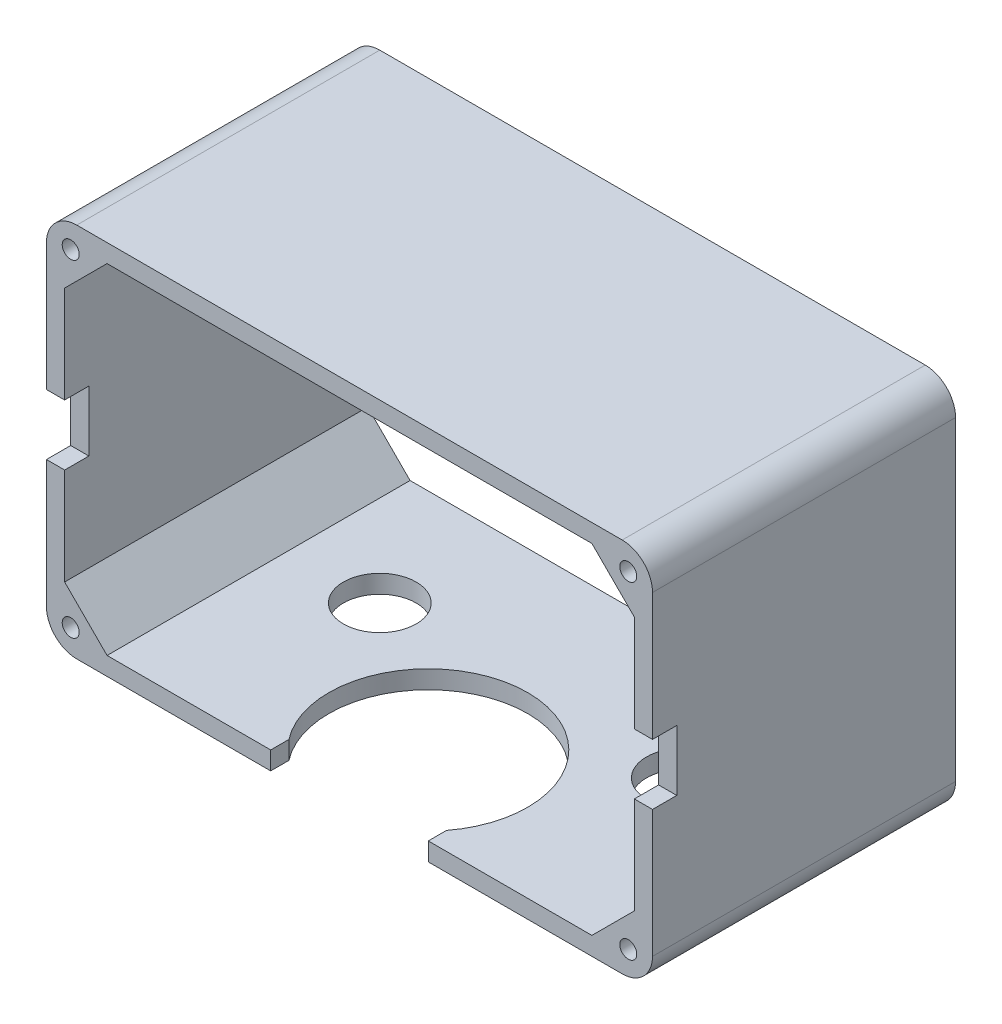
ISO-10303-21;
HEADER;
FILE_DESCRIPTION(('STEP AP214'),'2;1');
FILE_NAME('part.step','',(''),(''),'','','');
FILE_SCHEMA(('AUTOMOTIVE_DESIGN { 1 0 10303 214 1 1 1 1 }'));
ENDSEC;
DATA;
#1=APPLICATION_CONTEXT('core data for automotive mechanical design processes');
#2=APPLICATION_PROTOCOL_DEFINITION('international standard','automotive_design',2000,#1);
#3=PRODUCT_CONTEXT('',#1,'mechanical');
#4=PRODUCT('Part','Part','',(#3));
#5=PRODUCT_RELATED_PRODUCT_CATEGORY('part','',(#4));
#6=PRODUCT_DEFINITION_FORMATION('','',#4);
#7=PRODUCT_DEFINITION_CONTEXT('part definition',#1,'design');
#8=PRODUCT_DEFINITION('design','',#6,#7);
#9=PRODUCT_DEFINITION_SHAPE('','',#8);
#10=(LENGTH_UNIT() NAMED_UNIT(*) SI_UNIT(.MILLI.,.METRE.));
#11=(NAMED_UNIT(*) PLANE_ANGLE_UNIT() SI_UNIT($,.RADIAN.));
#12=(NAMED_UNIT(*) SI_UNIT($,.STERADIAN.) SOLID_ANGLE_UNIT());
#13=UNCERTAINTY_MEASURE_WITH_UNIT(LENGTH_MEASURE(1.E-05),#10,'distance_accuracy_value','');
#14=(GEOMETRIC_REPRESENTATION_CONTEXT(3) GLOBAL_UNCERTAINTY_ASSIGNED_CONTEXT((#13)) GLOBAL_UNIT_ASSIGNED_CONTEXT((#10,
#11,#12)) REPRESENTATION_CONTEXT('',''));
#15=CARTESIAN_POINT('',(0.,0.,0.));
#16=DIRECTION('',(0.,0.,1.));
#17=DIRECTION('',(1.,0.,0.));
#18=AXIS2_PLACEMENT_3D('',#15,#16,#17);
#19=CARTESIAN_POINT('',(-45.,26.,50.));
#20=DIRECTION('',(0.,0.,-1.));
#21=DIRECTION('',(-1.,0.,0.));
#22=AXIS2_PLACEMENT_3D('',#19,#20,#21);
#23=PLANE('',#22);
#24=CARTESIAN_POINT('',(-46.,27.,50.));
#25=DIRECTION('',(0.,0.,1.));
#26=DIRECTION('',(1.,0.,0.));
#27=AXIS2_PLACEMENT_3D('',#24,#25,#26);
#28=CIRCLE('',#27,1.4);
#29=CARTESIAN_POINT('',(-44.6,27.,50.));
#30=VERTEX_POINT('',#29);
#31=EDGE_CURVE('E313',#30,#30,#28,.T.);
#32=ORIENTED_EDGE('',*,*,#31,.F.);
#33=EDGE_LOOP('',(#32));
#34=FACE_BOUND('',#33,.T.);
#35=CARTESIAN_POINT('',(46.,27.,50.));
#36=DIRECTION('',(0.,0.,-1.));
#37=DIRECTION('',(-1.,0.,0.));
#38=AXIS2_PLACEMENT_3D('',#35,#36,#37);
#39=CIRCLE('',#38,1.4);
#40=CARTESIAN_POINT('',(44.6,27.,50.));
#41=VERTEX_POINT('',#40);
#42=EDGE_CURVE('E317',#41,#41,#39,.T.);
#43=ORIENTED_EDGE('',*,*,#42,.T.);
#44=EDGE_LOOP('',(#43));
#45=FACE_BOUND('',#44,.T.);
#46=DIRECTION('',(0.,-1.,0.));
#47=VECTOR('',#46,1.);
#48=CARTESIAN_POINT('',(-50.,26.,50.));
#49=LINE('',#48,#47);
#50=CARTESIAN_POINT('',(-50.,26.,50.));
#51=VERTEX_POINT('',#50);
#52=CARTESIAN_POINT('',(-50.,4.99999999999998,50.));
#53=VERTEX_POINT('',#52);
#54=EDGE_CURVE('E248',#51,#53,#49,.T.);
#55=ORIENTED_EDGE('',*,*,#54,.T.);
#56=DIRECTION('',(1.,0.,0.));
#57=VECTOR('',#56,1.);
#58=CARTESIAN_POINT('',(-50.,4.99999999999998,50.));
#59=LINE('',#58,#57);
#60=CARTESIAN_POINT('',(-47.,4.99999999999998,50.));
#61=VERTEX_POINT('',#60);
#62=EDGE_CURVE('E458',#53,#61,#59,.T.);
#63=ORIENTED_EDGE('',*,*,#62,.T.);
#64=DIRECTION('',(0.,-1.,0.));
#65=VECTOR('',#64,1.);
#66=CARTESIAN_POINT('',(-47.,23.,50.));
#67=LINE('',#66,#65);
#68=CARTESIAN_POINT('',(-47.,21.,50.));
#69=VERTEX_POINT('',#68);
#70=EDGE_CURVE('E370',#69,#61,#67,.T.);
#71=ORIENTED_EDGE('',*,*,#70,.F.);
#72=DIRECTION('',(0.707106781186547,0.707106781186548,0.));
#73=VECTOR('',#72,1.);
#74=CARTESIAN_POINT('',(-47.,21.,50.));
#75=LINE('',#74,#73);
#76=CARTESIAN_POINT('',(-40.,28.,50.));
#77=VERTEX_POINT('',#76);
#78=EDGE_CURVE('E312',#69,#77,#75,.T.);
#79=ORIENTED_EDGE('',*,*,#78,.T.);
#80=DIRECTION('',(-1.,0.,0.));
#81=VECTOR('',#80,1.);
#82=CARTESIAN_POINT('',(-42.,28.,50.));
#83=LINE('',#82,#81);
#84=CARTESIAN_POINT('',(40.,28.,50.));
#85=VERTEX_POINT('',#84);
#86=EDGE_CURVE('E278',#85,#77,#83,.T.);
#87=ORIENTED_EDGE('',*,*,#86,.F.);
#88=DIRECTION('',(-0.707106781186547,0.707106781186548,0.));
#89=VECTOR('',#88,1.);
#90=CARTESIAN_POINT('',(47.,21.,50.));
#91=LINE('',#90,#89);
#92=CARTESIAN_POINT('',(47.,21.,50.));
#93=VERTEX_POINT('',#92);
#94=EDGE_CURVE('E316',#93,#85,#91,.T.);
#95=ORIENTED_EDGE('',*,*,#94,.F.);
#96=DIRECTION('',(0.,1.,0.));
#97=VECTOR('',#96,1.);
#98=CARTESIAN_POINT('',(47.,23.,50.));
#99=LINE('',#98,#97);
#100=CARTESIAN_POINT('',(47.,4.99999999999999,50.));
#101=VERTEX_POINT('',#100);
#102=EDGE_CURVE('E377',#101,#93,#99,.T.);
#103=ORIENTED_EDGE('',*,*,#102,.F.);
#104=CARTESIAN_POINT('',(50.,4.99999999999999,50.));
#105=VERTEX_POINT('',#104);
#106=EDGE_CURVE('E465',#101,#105,#59,.T.);
#107=ORIENTED_EDGE('',*,*,#106,.T.);
#108=DIRECTION('',(0.,1.,0.));
#109=VECTOR('',#108,1.);
#110=CARTESIAN_POINT('',(50.,26.,50.));
#111=LINE('',#110,#109);
#112=CARTESIAN_POINT('',(50.,26.,50.));
#113=VERTEX_POINT('',#112);
#114=EDGE_CURVE('E265',#105,#113,#111,.T.);
#115=ORIENTED_EDGE('',*,*,#114,.T.);
#116=CARTESIAN_POINT('',(45.,26.,50.));
#117=DIRECTION('',(0.,0.,1.));
#118=DIRECTION('',(1.,0.,0.));
#119=AXIS2_PLACEMENT_3D('',#116,#117,#118);
#120=CIRCLE('',#119,5.);
#121=CARTESIAN_POINT('',(45.,31.,50.));
#122=VERTEX_POINT('',#121);
#123=EDGE_CURVE('E269',#113,#122,#120,.T.);
#124=ORIENTED_EDGE('',*,*,#123,.T.);
#125=DIRECTION('',(-1.,0.,0.));
#126=VECTOR('',#125,1.);
#127=CARTESIAN_POINT('',(-45.,31.,50.));
#128=LINE('',#127,#126);
#129=CARTESIAN_POINT('',(-45.,31.,50.));
#130=VERTEX_POINT('',#129);
#131=EDGE_CURVE('E271',#122,#130,#128,.T.);
#132=ORIENTED_EDGE('',*,*,#131,.T.);
#133=CARTESIAN_POINT('',(-45.,26.,50.));
#134=DIRECTION('',(0.,0.,1.));
#135=DIRECTION('',(-1.,0.,0.));
#136=AXIS2_PLACEMENT_3D('',#133,#134,#135);
#137=CIRCLE('',#136,5.);
#138=EDGE_CURVE('E249',#130,#51,#137,.T.);
#139=ORIENTED_EDGE('',*,*,#138,.T.);
#140=EDGE_LOOP('',(#55,#63,#71,#79,#87,#95,#103,#107,#115,#124,#132,#139));
#141=FACE_BOUND('',#140,.T.);
#142=ADVANCED_FACE('F38',(#34,#45,#141),#23,.F.);
#143=CARTESIAN_POINT('',(46.,-27.,50.));
#144=DIRECTION('',(0.,0.,1.));
#145=DIRECTION('',(-1.,0.,0.));
#146=AXIS2_PLACEMENT_3D('',#143,#144,#145);
#147=CIRCLE('',#146,1.4);
#148=CARTESIAN_POINT('',(44.6,-27.,50.));
#149=VERTEX_POINT('',#148);
#150=EDGE_CURVE('E321',#149,#149,#147,.T.);
#151=ORIENTED_EDGE('',*,*,#150,.F.);
#152=EDGE_LOOP('',(#151));
#153=FACE_BOUND('',#152,.T.);
#154=CARTESIAN_POINT('',(50.,-26.,50.));
#155=VERTEX_POINT('',#154);
#156=CARTESIAN_POINT('',(50.,-5.00000000000001,50.));
#157=VERTEX_POINT('',#156);
#158=EDGE_CURVE('E266',#155,#157,#111,.T.);
#159=ORIENTED_EDGE('',*,*,#158,.T.);
#160=DIRECTION('',(1.,0.,0.));
#161=VECTOR('',#160,1.);
#162=CARTESIAN_POINT('',(-50.,-5.00000000000002,50.));
#163=LINE('',#162,#161);
#164=CARTESIAN_POINT('',(47.,-5.00000000000001,50.));
#165=VERTEX_POINT('',#164);
#166=EDGE_CURVE('E63',#165,#157,#163,.T.);
#167=ORIENTED_EDGE('',*,*,#166,.F.);
#168=CARTESIAN_POINT('',(47.,-21.,50.));
#169=VERTEX_POINT('',#168);
#170=EDGE_CURVE('E378',#169,#165,#99,.T.);
#171=ORIENTED_EDGE('',*,*,#170,.F.);
#172=DIRECTION('',(-0.707106781186547,-0.707106781186548,0.));
#173=VECTOR('',#172,1.);
#174=CARTESIAN_POINT('',(47.,-21.,50.));
#175=LINE('',#174,#173);
#176=CARTESIAN_POINT('',(40.,-28.,50.));
#177=VERTEX_POINT('',#176);
#178=EDGE_CURVE('E320',#169,#177,#175,.T.);
#179=ORIENTED_EDGE('',*,*,#178,.T.);
#180=DIRECTION('',(1.,0.,0.));
#181=VECTOR('',#180,1.);
#182=CARTESIAN_POINT('',(-42.,-28.,50.));
#183=LINE('',#182,#181);
#184=CARTESIAN_POINT('',(13.,-28.,50.));
#185=VERTEX_POINT('',#184);
#186=EDGE_CURVE('E373',#185,#177,#183,.T.);
#187=ORIENTED_EDGE('',*,*,#186,.F.);
#188=DIRECTION('',(0.,-1.,0.));
#189=VECTOR('',#188,1.);
#190=CARTESIAN_POINT('',(13.,-21.,50.));
#191=LINE('',#190,#189);
#192=CARTESIAN_POINT('',(13.,-31.,50.));
#193=VERTEX_POINT('',#192);
#194=EDGE_CURVE('E426',#185,#193,#191,.T.);
#195=ORIENTED_EDGE('',*,*,#194,.T.);
#196=DIRECTION('',(1.,0.,0.));
#197=VECTOR('',#196,1.);
#198=CARTESIAN_POINT('',(-45.,-31.,50.));
#199=LINE('',#198,#197);
#200=CARTESIAN_POINT('',(45.,-31.,50.));
#201=VERTEX_POINT('',#200);
#202=EDGE_CURVE('E259',#193,#201,#199,.T.);
#203=ORIENTED_EDGE('',*,*,#202,.T.);
#204=CARTESIAN_POINT('',(45.,-26.,50.));
#205=DIRECTION('',(0.,0.,1.));
#206=DIRECTION('',(1.,0.,0.));
#207=AXIS2_PLACEMENT_3D('',#204,#205,#206);
#208=CIRCLE('',#207,5.);
#209=EDGE_CURVE('E263',#201,#155,#208,.T.);
#210=ORIENTED_EDGE('',*,*,#209,.T.);
#211=EDGE_LOOP('',(#159,#167,#171,#179,#187,#195,#203,#210));
#212=FACE_BOUND('',#211,.T.);
#213=ADVANCED_FACE('F508',(#153,#212),#23,.F.);
#214=CARTESIAN_POINT('',(-47.,23.,50.));
#215=DIRECTION('',(1.,0.,0.));
#216=DIRECTION('',(0.,1.,0.));
#217=AXIS2_PLACEMENT_3D('',#214,#215,#216);
#218=PLANE('',#217);
#219=DIRECTION('',(0.,0.,1.));
#220=VECTOR('',#219,1.);
#221=CARTESIAN_POINT('',(-47.,4.99999999999998,50.));
#222=LINE('',#221,#220);
#223=CARTESIAN_POINT('',(-47.,4.99999999999998,46.));
#224=VERTEX_POINT('',#223);
#225=EDGE_CURVE('E446',#224,#61,#222,.T.);
#226=ORIENTED_EDGE('',*,*,#225,.F.);
#227=DIRECTION('',(0.,1.,0.));
#228=VECTOR('',#227,1.);
#229=CARTESIAN_POINT('',(-47.,23.,46.));
#230=LINE('',#229,#228);
#231=CARTESIAN_POINT('',(-47.,-5.00000000000002,46.));
#232=VERTEX_POINT('',#231);
#233=EDGE_CURVE('E452',#232,#224,#230,.T.);
#234=ORIENTED_EDGE('',*,*,#233,.F.);
#235=DIRECTION('',(0.,0.,-1.));
#236=VECTOR('',#235,1.);
#237=CARTESIAN_POINT('',(-47.,-5.00000000000002,50.));
#238=LINE('',#237,#236);
#239=CARTESIAN_POINT('',(-47.,-5.00000000000002,50.));
#240=VERTEX_POINT('',#239);
#241=EDGE_CURVE('E395',#240,#232,#238,.T.);
#242=ORIENTED_EDGE('',*,*,#241,.F.);
#243=CARTESIAN_POINT('',(-47.,-21.,50.));
#244=VERTEX_POINT('',#243);
#245=EDGE_CURVE('E242',#240,#244,#67,.T.);
#246=ORIENTED_EDGE('',*,*,#245,.T.);
#247=DIRECTION('',(0.,0.,1.));
#248=VECTOR('',#247,1.);
#249=CARTESIAN_POINT('',(-47.,-21.,0.));
#250=LINE('',#249,#248);
#251=CARTESIAN_POINT('',(-47.,-21.,0.));
#252=VERTEX_POINT('',#251);
#253=EDGE_CURVE('E328',#252,#244,#250,.T.);
#254=ORIENTED_EDGE('',*,*,#253,.F.);
#255=DIRECTION('',(0.,-1.,0.));
#256=VECTOR('',#255,1.);
#257=CARTESIAN_POINT('',(-47.,23.,0.));
#258=LINE('',#257,#256);
#259=CARTESIAN_POINT('',(-47.,21.,0.));
#260=VERTEX_POINT('',#259);
#261=EDGE_CURVE('E368',#260,#252,#258,.T.);
#262=ORIENTED_EDGE('',*,*,#261,.F.);
#263=DIRECTION('',(0.,0.,1.));
#264=VECTOR('',#263,1.);
#265=CARTESIAN_POINT('',(-47.,21.,0.));
#266=LINE('',#265,#264);
#267=EDGE_CURVE('E362',#260,#69,#266,.T.);
#268=ORIENTED_EDGE('',*,*,#267,.T.);
#269=ORIENTED_EDGE('',*,*,#70,.T.);
#270=EDGE_LOOP('',(#226,#234,#242,#246,#254,#262,#268,#269));
#271=FACE_BOUND('',#270,.T.);
#272=ADVANCED_FACE('F393',(#271),#218,.T.);
#273=CARTESIAN_POINT('',(-42.,-28.,50.));
#274=DIRECTION('',(0.,1.,0.));
#275=DIRECTION('',(0.,0.,1.));
#276=AXIS2_PLACEMENT_3D('',#273,#274,#275);
#277=PLANE('',#276);
#278=CARTESIAN_POINT('',(-25.,-28.,20.));
#279=DIRECTION('',(0.,1.,0.));
#280=DIRECTION('',(0.,0.,1.));
#281=AXIS2_PLACEMENT_3D('',#278,#279,#280);
#282=CIRCLE('',#281,6.);
#283=CARTESIAN_POINT('',(-25.,-28.,26.));
#284=VERTEX_POINT('',#283);
#285=EDGE_CURVE('E436',#284,#284,#282,.T.);
#286=ORIENTED_EDGE('',*,*,#285,.F.);
#287=EDGE_LOOP('',(#286));
#288=FACE_BOUND('',#287,.T.);
#289=CARTESIAN_POINT('',(25.,-28.,20.));
#290=DIRECTION('',(0.,1.,0.));
#291=DIRECTION('',(0.,0.,1.));
#292=AXIS2_PLACEMENT_3D('',#289,#290,#291);
#293=CIRCLE('',#292,6.);
#294=CARTESIAN_POINT('',(25.,-28.,26.));
#295=VERTEX_POINT('',#294);
#296=EDGE_CURVE('E439',#295,#295,#293,.T.);
#297=ORIENTED_EDGE('',*,*,#296,.F.);
#298=EDGE_LOOP('',(#297));
#299=FACE_BOUND('',#298,.T.);
#300=DIRECTION('',(0.,0.,1.));
#301=VECTOR('',#300,1.);
#302=CARTESIAN_POINT('',(-13.,-28.,50.));
#303=LINE('',#302,#301);
#304=CARTESIAN_POINT('',(-13.,-28.,47.));
#305=VERTEX_POINT('',#304);
#306=CARTESIAN_POINT('',(-13.,-28.,50.));
#307=VERTEX_POINT('',#306);
#308=EDGE_CURVE('E413',#305,#307,#303,.T.);
#309=ORIENTED_EDGE('',*,*,#308,.F.);
#310=CARTESIAN_POINT('',(0.,-28.,37.));
#311=DIRECTION('',(0.,1.,0.));
#312=DIRECTION('',(0.,0.,1.));
#313=AXIS2_PLACEMENT_3D('',#310,#311,#312);
#314=CIRCLE('',#313,16.4012194668567);
#315=CARTESIAN_POINT('',(13.,-28.,47.));
#316=VERTEX_POINT('',#315);
#317=EDGE_CURVE('E417',#316,#305,#314,.T.);
#318=ORIENTED_EDGE('',*,*,#317,.F.);
#319=DIRECTION('',(0.,0.,-1.));
#320=VECTOR('',#319,1.);
#321=CARTESIAN_POINT('',(13.,-28.,50.0000000000001));
#322=LINE('',#321,#320);
#323=EDGE_CURVE('E415',#185,#316,#322,.T.);
#324=ORIENTED_EDGE('',*,*,#323,.F.);
#325=ORIENTED_EDGE('',*,*,#186,.T.);
#326=DIRECTION('',(0.,0.,1.));
#327=VECTOR('',#326,1.);
#328=CARTESIAN_POINT('',(40.,-28.,0.));
#329=LINE('',#328,#327);
#330=CARTESIAN_POINT('',(40.,-28.,0.));
#331=VERTEX_POINT('',#330);
#332=EDGE_CURVE('E340',#331,#177,#329,.T.);
#333=ORIENTED_EDGE('',*,*,#332,.F.);
#334=DIRECTION('',(1.,0.,0.));
#335=VECTOR('',#334,1.);
#336=CARTESIAN_POINT('',(-42.,-28.,0.));
#337=LINE('',#336,#335);
#338=CARTESIAN_POINT('',(-40.,-28.,0.));
#339=VERTEX_POINT('',#338);
#340=EDGE_CURVE('E384',#339,#331,#337,.T.);
#341=ORIENTED_EDGE('',*,*,#340,.F.);
#342=DIRECTION('',(0.,0.,1.));
#343=VECTOR('',#342,1.);
#344=CARTESIAN_POINT('',(-40.,-28.,0.));
#345=LINE('',#344,#343);
#346=CARTESIAN_POINT('',(-40.,-28.,50.));
#347=VERTEX_POINT('',#346);
#348=EDGE_CURVE('E333',#339,#347,#345,.T.);
#349=ORIENTED_EDGE('',*,*,#348,.T.);
#350=EDGE_CURVE('E374',#347,#307,#183,.T.);
#351=ORIENTED_EDGE('',*,*,#350,.T.);
#352=EDGE_LOOP('',(#309,#318,#324,#325,#333,#341,#349,#351));
#353=FACE_BOUND('',#352,.T.);
#354=ADVANCED_FACE('F524',(#288,#299,#353),#277,.T.);
#355=CARTESIAN_POINT('',(47.,23.,50.));
#356=DIRECTION('',(-1.,0.,0.));
#357=DIRECTION('',(0.,-1.,0.));
#358=AXIS2_PLACEMENT_3D('',#355,#356,#357);
#359=PLANE('',#358);
#360=DIRECTION('',(0.,0.,-1.));
#361=VECTOR('',#360,1.);
#362=CARTESIAN_POINT('',(47.,4.99999999999999,50.));
#363=LINE('',#362,#361);
#364=CARTESIAN_POINT('',(47.,4.99999999999999,46.));
#365=VERTEX_POINT('',#364);
#366=EDGE_CURVE('E450',#101,#365,#363,.T.);
#367=ORIENTED_EDGE('',*,*,#366,.F.);
#368=ORIENTED_EDGE('',*,*,#102,.T.);
#369=DIRECTION('',(0.,0.,1.));
#370=VECTOR('',#369,1.);
#371=CARTESIAN_POINT('',(47.,21.,0.));
#372=LINE('',#371,#370);
#373=CARTESIAN_POINT('',(47.,21.,0.));
#374=VERTEX_POINT('',#373);
#375=EDGE_CURVE('E352',#374,#93,#372,.T.);
#376=ORIENTED_EDGE('',*,*,#375,.F.);
#377=DIRECTION('',(0.,1.,0.));
#378=VECTOR('',#377,1.);
#379=CARTESIAN_POINT('',(47.,23.,0.));
#380=LINE('',#379,#378);
#381=CARTESIAN_POINT('',(47.,-21.,0.));
#382=VERTEX_POINT('',#381);
#383=EDGE_CURVE('E386',#382,#374,#380,.T.);
#384=ORIENTED_EDGE('',*,*,#383,.F.);
#385=DIRECTION('',(0.,0.,1.));
#386=VECTOR('',#385,1.);
#387=CARTESIAN_POINT('',(47.,-21.,0.));
#388=LINE('',#387,#386);
#389=EDGE_CURVE('E338',#382,#169,#388,.T.);
#390=ORIENTED_EDGE('',*,*,#389,.T.);
#391=ORIENTED_EDGE('',*,*,#170,.T.);
#392=DIRECTION('',(0.,0.,1.));
#393=VECTOR('',#392,1.);
#394=CARTESIAN_POINT('',(47.,-5.00000000000001,50.));
#395=LINE('',#394,#393);
#396=CARTESIAN_POINT('',(47.,-5.00000000000001,46.));
#397=VERTEX_POINT('',#396);
#398=EDGE_CURVE('E457',#397,#165,#395,.T.);
#399=ORIENTED_EDGE('',*,*,#398,.F.);
#400=DIRECTION('',(0.,-1.,0.));
#401=VECTOR('',#400,1.);
#402=CARTESIAN_POINT('',(47.,23.,46.));
#403=LINE('',#402,#401);
#404=EDGE_CURVE('E454',#365,#397,#403,.T.);
#405=ORIENTED_EDGE('',*,*,#404,.F.);
#406=EDGE_LOOP('',(#367,#368,#376,#384,#390,#391,#399,#405));
#407=FACE_BOUND('',#406,.T.);
#408=ADVANCED_FACE('F567',(#407),#359,.T.);
#409=CARTESIAN_POINT('',(-42.,28.,50.));
#410=DIRECTION('',(0.,-1.,0.));
#411=DIRECTION('',(0.,0.,-1.));
#412=AXIS2_PLACEMENT_3D('',#409,#410,#411);
#413=PLANE('',#412);
#414=DIRECTION('',(-1.,0.,0.));
#415=VECTOR('',#414,1.);
#416=CARTESIAN_POINT('',(-42.,28.,0.));
#417=LINE('',#416,#415);
#418=CARTESIAN_POINT('',(40.,28.,0.));
#419=VERTEX_POINT('',#418);
#420=CARTESIAN_POINT('',(-40.,28.,0.));
#421=VERTEX_POINT('',#420);
#422=EDGE_CURVE('E387',#419,#421,#417,.T.);
#423=ORIENTED_EDGE('',*,*,#422,.F.);
#424=DIRECTION('',(0.,0.,1.));
#425=VECTOR('',#424,1.);
#426=CARTESIAN_POINT('',(40.,28.,0.));
#427=LINE('',#426,#425);
#428=EDGE_CURVE('E349',#419,#85,#427,.T.);
#429=ORIENTED_EDGE('',*,*,#428,.T.);
#430=ORIENTED_EDGE('',*,*,#86,.T.);
#431=DIRECTION('',(0.,0.,1.));
#432=VECTOR('',#431,1.);
#433=CARTESIAN_POINT('',(-40.,28.,0.));
#434=LINE('',#433,#432);
#435=EDGE_CURVE('E365',#421,#77,#434,.T.);
#436=ORIENTED_EDGE('',*,*,#435,.F.);
#437=EDGE_LOOP('',(#423,#429,#430,#436));
#438=FACE_BOUND('',#437,.T.);
#439=ADVANCED_FACE('F560',(#438),#413,.T.);
#440=CARTESIAN_POINT('',(-46.,-27.,50.));
#441=DIRECTION('',(0.,0.,-1.));
#442=DIRECTION('',(1.,0.,0.));
#443=AXIS2_PLACEMENT_3D('',#440,#441,#442);
#444=CIRCLE('',#443,1.4);
#445=CARTESIAN_POINT('',(-44.6,-27.,50.));
#446=VERTEX_POINT('',#445);
#447=EDGE_CURVE('E409',#446,#446,#444,.T.);
#448=ORIENTED_EDGE('',*,*,#447,.T.);
#449=EDGE_LOOP('',(#448));
#450=FACE_BOUND('',#449,.T.);
#451=ORIENTED_EDGE('',*,*,#245,.F.);
#452=CARTESIAN_POINT('',(-50.,-5.00000000000002,50.));
#453=VERTEX_POINT('',#452);
#454=EDGE_CURVE('E229',#453,#240,#163,.T.);
#455=ORIENTED_EDGE('',*,*,#454,.F.);
#456=CARTESIAN_POINT('',(-50.,-26.,50.));
#457=VERTEX_POINT('',#456);
#458=EDGE_CURVE('E239',#453,#457,#49,.T.);
#459=ORIENTED_EDGE('',*,*,#458,.T.);
#460=CARTESIAN_POINT('',(-45.,-26.,50.));
#461=DIRECTION('',(0.,0.,1.));
#462=DIRECTION('',(-1.,0.,0.));
#463=AXIS2_PLACEMENT_3D('',#460,#461,#462);
#464=CIRCLE('',#463,5.);
#465=CARTESIAN_POINT('',(-45.,-31.,50.));
#466=VERTEX_POINT('',#465);
#467=EDGE_CURVE('E252',#457,#466,#464,.T.);
#468=ORIENTED_EDGE('',*,*,#467,.T.);
#469=CARTESIAN_POINT('',(-13.,-31.,50.));
#470=VERTEX_POINT('',#469);
#471=EDGE_CURVE('E260',#466,#470,#199,.T.);
#472=ORIENTED_EDGE('',*,*,#471,.T.);
#473=DIRECTION('',(0.,-1.,0.));
#474=VECTOR('',#473,1.);
#475=CARTESIAN_POINT('',(-13.,-21.,50.));
#476=LINE('',#475,#474);
#477=EDGE_CURVE('E419',#307,#470,#476,.T.);
#478=ORIENTED_EDGE('',*,*,#477,.F.);
#479=ORIENTED_EDGE('',*,*,#350,.F.);
#480=DIRECTION('',(0.707106781186547,-0.707106781186548,0.));
#481=VECTOR('',#480,1.);
#482=CARTESIAN_POINT('',(-47.,-21.,50.));
#483=LINE('',#482,#481);
#484=EDGE_CURVE('E401',#244,#347,#483,.T.);
#485=ORIENTED_EDGE('',*,*,#484,.F.);
#486=EDGE_LOOP('',(#451,#455,#459,#468,#472,#478,#479,#485));
#487=FACE_BOUND('',#486,.T.);
#488=ADVANCED_FACE('F238',(#450,#487),#23,.F.);
#489=CARTESIAN_POINT('',(-45.,26.,0.));
#490=DIRECTION('',(0.,0.,-1.));
#491=DIRECTION('',(-1.,0.,0.));
#492=AXIS2_PLACEMENT_3D('',#489,#490,#491);
#493=PLANE('',#492);
#494=CARTESIAN_POINT('',(-46.,-27.,0.));
#495=DIRECTION('',(0.,0.,-1.));
#496=DIRECTION('',(-1.,0.,0.));
#497=AXIS2_PLACEMENT_3D('',#494,#495,#496);
#498=CIRCLE('',#497,1.4);
#499=CARTESIAN_POINT('',(-47.4,-27.,0.));
#500=VERTEX_POINT('',#499);
#501=EDGE_CURVE('E42',#500,#500,#498,.F.);
#502=ORIENTED_EDGE('',*,*,#501,.T.);
#503=EDGE_LOOP('',(#502));
#504=FACE_BOUND('',#503,.T.);
#505=ORIENTED_EDGE('',*,*,#261,.T.);
#506=DIRECTION('',(0.707106781186547,-0.707106781186548,0.));
#507=VECTOR('',#506,1.);
#508=CARTESIAN_POINT('',(-47.,-21.,0.));
#509=LINE('',#508,#507);
#510=EDGE_CURVE('E403',#252,#339,#509,.T.);
#511=ORIENTED_EDGE('',*,*,#510,.T.);
#512=ORIENTED_EDGE('',*,*,#340,.T.);
#513=DIRECTION('',(-0.707106781186547,-0.707106781186548,0.));
#514=VECTOR('',#513,1.);
#515=CARTESIAN_POINT('',(47.,-21.,0.));
#516=LINE('',#515,#514);
#517=EDGE_CURVE('E325',#382,#331,#516,.T.);
#518=ORIENTED_EDGE('',*,*,#517,.F.);
#519=ORIENTED_EDGE('',*,*,#383,.T.);
#520=DIRECTION('',(-0.707106781186547,0.707106781186548,0.));
#521=VECTOR('',#520,1.);
#522=CARTESIAN_POINT('',(47.,21.,0.));
#523=LINE('',#522,#521);
#524=EDGE_CURVE('E346',#374,#419,#523,.T.);
#525=ORIENTED_EDGE('',*,*,#524,.T.);
#526=ORIENTED_EDGE('',*,*,#422,.T.);
#527=DIRECTION('',(0.707106781186547,0.707106781186548,0.));
#528=VECTOR('',#527,1.);
#529=CARTESIAN_POINT('',(-47.,21.,0.));
#530=LINE('',#529,#528);
#531=EDGE_CURVE('E359',#260,#421,#530,.T.);
#532=ORIENTED_EDGE('',*,*,#531,.F.);
#533=EDGE_LOOP('',(#505,#511,#512,#518,#519,#525,#526,#532));
#534=FACE_BOUND('',#533,.T.);
#535=CARTESIAN_POINT('',(46.,-27.,0.));
#536=DIRECTION('',(0.,0.,-1.));
#537=DIRECTION('',(-1.,0.,0.));
#538=AXIS2_PLACEMENT_3D('',#535,#536,#537);
#539=CIRCLE('',#538,1.4);
#540=CARTESIAN_POINT('',(44.6,-27.,0.));
#541=VERTEX_POINT('',#540);
#542=EDGE_CURVE('E318',#541,#541,#539,.T.);
#543=ORIENTED_EDGE('',*,*,#542,.F.);
#544=EDGE_LOOP('',(#543));
#545=FACE_BOUND('',#544,.T.);
#546=CARTESIAN_POINT('',(46.,27.,0.));
#547=DIRECTION('',(0.,0.,-1.));
#548=DIRECTION('',(-1.,0.,0.));
#549=AXIS2_PLACEMENT_3D('',#546,#547,#548);
#550=CIRCLE('',#549,1.4);
#551=CARTESIAN_POINT('',(44.6,27.,0.));
#552=VERTEX_POINT('',#551);
#553=EDGE_CURVE('E314',#552,#552,#550,.F.);
#554=ORIENTED_EDGE('',*,*,#553,.T.);
#555=EDGE_LOOP('',(#554));
#556=FACE_BOUND('',#555,.T.);
#557=CARTESIAN_POINT('',(-46.,27.,0.));
#558=DIRECTION('',(0.,0.,-1.));
#559=DIRECTION('',(-1.,0.,0.));
#560=AXIS2_PLACEMENT_3D('',#557,#558,#559);
#561=CIRCLE('',#560,1.4);
#562=CARTESIAN_POINT('',(-47.4,27.,0.));
#563=VERTEX_POINT('',#562);
#564=EDGE_CURVE('E309',#563,#563,#561,.T.);
#565=ORIENTED_EDGE('',*,*,#564,.F.);
#566=EDGE_LOOP('',(#565));
#567=FACE_BOUND('',#566,.T.);
#568=CARTESIAN_POINT('',(-45.,26.,0.));
#569=DIRECTION('',(0.,0.,1.));
#570=DIRECTION('',(-1.,0.,0.));
#571=AXIS2_PLACEMENT_3D('',#568,#569,#570);
#572=CIRCLE('',#571,5.);
#573=CARTESIAN_POINT('',(-45.,31.,0.));
#574=VERTEX_POINT('',#573);
#575=CARTESIAN_POINT('',(-50.,26.,0.));
#576=VERTEX_POINT('',#575);
#577=EDGE_CURVE('E274',#574,#576,#572,.T.);
#578=ORIENTED_EDGE('',*,*,#577,.F.);
#579=DIRECTION('',(-1.,0.,0.));
#580=VECTOR('',#579,1.);
#581=CARTESIAN_POINT('',(-45.,31.,0.));
#582=LINE('',#581,#580);
#583=CARTESIAN_POINT('',(45.,31.,0.));
#584=VERTEX_POINT('',#583);
#585=EDGE_CURVE('E254',#584,#574,#582,.T.);
#586=ORIENTED_EDGE('',*,*,#585,.F.);
#587=CARTESIAN_POINT('',(45.,26.,0.));
#588=DIRECTION('',(0.,0.,1.));
#589=DIRECTION('',(1.,0.,0.));
#590=AXIS2_PLACEMENT_3D('',#587,#588,#589);
#591=CIRCLE('',#590,5.);
#592=CARTESIAN_POINT('',(50.,26.,0.));
#593=VERTEX_POINT('',#592);
#594=EDGE_CURVE('E288',#593,#584,#591,.T.);
#595=ORIENTED_EDGE('',*,*,#594,.F.);
#596=DIRECTION('',(0.,1.,0.));
#597=VECTOR('',#596,1.);
#598=CARTESIAN_POINT('',(50.,26.,0.));
#599=LINE('',#598,#597);
#600=CARTESIAN_POINT('',(50.,-26.,0.));
#601=VERTEX_POINT('',#600);
#602=EDGE_CURVE('E286',#601,#593,#599,.T.);
#603=ORIENTED_EDGE('',*,*,#602,.F.);
#604=CARTESIAN_POINT('',(45.,-26.,0.));
#605=DIRECTION('',(0.,0.,1.));
#606=DIRECTION('',(1.,0.,0.));
#607=AXIS2_PLACEMENT_3D('',#604,#605,#606);
#608=CIRCLE('',#607,5.);
#609=CARTESIAN_POINT('',(45.,-31.,0.));
#610=VERTEX_POINT('',#609);
#611=EDGE_CURVE('E284',#610,#601,#608,.T.);
#612=ORIENTED_EDGE('',*,*,#611,.F.);
#613=DIRECTION('',(1.,0.,0.));
#614=VECTOR('',#613,1.);
#615=CARTESIAN_POINT('',(-45.,-31.,0.));
#616=LINE('',#615,#614);
#617=CARTESIAN_POINT('',(-45.,-31.,0.));
#618=VERTEX_POINT('',#617);
#619=EDGE_CURVE('E282',#618,#610,#616,.T.);
#620=ORIENTED_EDGE('',*,*,#619,.F.);
#621=CARTESIAN_POINT('',(-45.,-26.,0.));
#622=DIRECTION('',(0.,0.,1.));
#623=DIRECTION('',(-1.,0.,0.));
#624=AXIS2_PLACEMENT_3D('',#621,#622,#623);
#625=CIRCLE('',#624,5.);
#626=CARTESIAN_POINT('',(-50.,-26.,0.));
#627=VERTEX_POINT('',#626);
#628=EDGE_CURVE('E280',#627,#618,#625,.T.);
#629=ORIENTED_EDGE('',*,*,#628,.F.);
#630=DIRECTION('',(0.,-1.,0.));
#631=VECTOR('',#630,1.);
#632=CARTESIAN_POINT('',(-50.,26.,0.));
#633=LINE('',#632,#631);
#634=EDGE_CURVE('E277',#576,#627,#633,.T.);
#635=ORIENTED_EDGE('',*,*,#634,.F.);
#636=EDGE_LOOP('',(#578,#586,#595,#603,#612,#620,#629,#635));
#637=FACE_BOUND('',#636,.T.);
#638=ADVANCED_FACE('F493',(#504,#534,#545,#556,#567,#637),#493,.T.);
#639=CARTESIAN_POINT('',(-45.,26.,50.));
#640=DIRECTION('',(0.,0.,-1.));
#641=DIRECTION('',(-1.,0.,0.));
#642=AXIS2_PLACEMENT_3D('',#639,#640,#641);
#643=CYLINDRICAL_SURFACE('',#642,5.);
#644=ORIENTED_EDGE('',*,*,#577,.T.);
#645=DIRECTION('',(0.,0.,-1.));
#646=VECTOR('',#645,1.);
#647=CARTESIAN_POINT('',(-50.,26.,50.));
#648=LINE('',#647,#646);
#649=EDGE_CURVE('E11',#51,#576,#648,.T.);
#650=ORIENTED_EDGE('',*,*,#649,.F.);
#651=ORIENTED_EDGE('',*,*,#138,.F.);
#652=DIRECTION('',(0.,0.,-1.));
#653=VECTOR('',#652,1.);
#654=CARTESIAN_POINT('',(-45.,31.,50.));
#655=LINE('',#654,#653);
#656=EDGE_CURVE('E273',#130,#574,#655,.T.);
#657=ORIENTED_EDGE('',*,*,#656,.T.);
#658=EDGE_LOOP('',(#644,#650,#651,#657));
#659=FACE_BOUND('',#658,.T.);
#660=ADVANCED_FACE('F40',(#659),#643,.T.);
#661=CARTESIAN_POINT('',(-50.,26.,50.));
#662=DIRECTION('',(1.,0.,0.));
#663=DIRECTION('',(0.,1.,0.));
#664=AXIS2_PLACEMENT_3D('',#661,#662,#663);
#665=PLANE('',#664);
#666=DIRECTION('',(0.,1.,0.));
#667=VECTOR('',#666,1.);
#668=CARTESIAN_POINT('',(-50.,4.99999999999998,46.));
#669=LINE('',#668,#667);
#670=CARTESIAN_POINT('',(-50.,-5.00000000000002,46.));
#671=VERTEX_POINT('',#670);
#672=CARTESIAN_POINT('',(-50.,4.99999999999998,46.));
#673=VERTEX_POINT('',#672);
#674=EDGE_CURVE('E55',#671,#673,#669,.T.);
#675=ORIENTED_EDGE('',*,*,#674,.T.);
#676=DIRECTION('',(0.,0.,1.));
#677=VECTOR('',#676,1.);
#678=CARTESIAN_POINT('',(-50.,4.99999999999998,50.));
#679=LINE('',#678,#677);
#680=EDGE_CURVE('E474',#673,#53,#679,.T.);
#681=ORIENTED_EDGE('',*,*,#680,.T.);
#682=ORIENTED_EDGE('',*,*,#54,.F.);
#683=ORIENTED_EDGE('',*,*,#649,.T.);
#684=ORIENTED_EDGE('',*,*,#634,.T.);
#685=DIRECTION('',(0.,0.,-1.));
#686=VECTOR('',#685,1.);
#687=CARTESIAN_POINT('',(-50.,-26.,50.));
#688=LINE('',#687,#686);
#689=EDGE_CURVE('E47',#457,#627,#688,.T.);
#690=ORIENTED_EDGE('',*,*,#689,.F.);
#691=ORIENTED_EDGE('',*,*,#458,.F.);
#692=DIRECTION('',(0.,0.,-1.));
#693=VECTOR('',#692,1.);
#694=CARTESIAN_POINT('',(-50.,-5.00000000000002,50.));
#695=LINE('',#694,#693);
#696=EDGE_CURVE('E226',#453,#671,#695,.T.);
#697=ORIENTED_EDGE('',*,*,#696,.T.);
#698=EDGE_LOOP('',(#675,#681,#682,#683,#684,#690,#691,#697));
#699=FACE_BOUND('',#698,.T.);
#700=ADVANCED_FACE('F245',(#699),#665,.F.);
#701=CARTESIAN_POINT('',(-45.,-26.,50.));
#702=DIRECTION('',(0.,0.,-1.));
#703=DIRECTION('',(-1.,0.,0.));
#704=AXIS2_PLACEMENT_3D('',#701,#702,#703);
#705=CYLINDRICAL_SURFACE('',#704,5.);
#706=ORIENTED_EDGE('',*,*,#628,.T.);
#707=DIRECTION('',(0.,0.,-1.));
#708=VECTOR('',#707,1.);
#709=CARTESIAN_POINT('',(-45.,-31.,50.));
#710=LINE('',#709,#708);
#711=EDGE_CURVE('E305',#466,#618,#710,.T.);
#712=ORIENTED_EDGE('',*,*,#711,.F.);
#713=ORIENTED_EDGE('',*,*,#467,.F.);
#714=ORIENTED_EDGE('',*,*,#689,.T.);
#715=EDGE_LOOP('',(#706,#712,#713,#714));
#716=FACE_BOUND('',#715,.T.);
#717=ADVANCED_FACE('F490',(#716),#705,.T.);
#718=CARTESIAN_POINT('',(-45.,-31.,50.));
#719=DIRECTION('',(0.,1.,0.));
#720=DIRECTION('',(-1.,0.,0.));
#721=AXIS2_PLACEMENT_3D('',#718,#719,#720);
#722=PLANE('',#721);
#723=CARTESIAN_POINT('',(-25.,-31.,20.));
#724=DIRECTION('',(0.,-1.,0.));
#725=DIRECTION('',(0.,0.,-1.));
#726=AXIS2_PLACEMENT_3D('',#723,#724,#725);
#727=CIRCLE('',#726,6.);
#728=CARTESIAN_POINT('',(-25.,-31.,14.));
#729=VERTEX_POINT('',#728);
#730=EDGE_CURVE('E442',#729,#729,#727,.T.);
#731=ORIENTED_EDGE('',*,*,#730,.F.);
#732=EDGE_LOOP('',(#731));
#733=FACE_BOUND('',#732,.T.);
#734=CARTESIAN_POINT('',(25.,-31.,20.));
#735=DIRECTION('',(0.,-1.,0.));
#736=DIRECTION('',(0.,0.,-1.));
#737=AXIS2_PLACEMENT_3D('',#734,#735,#736);
#738=CIRCLE('',#737,6.);
#739=CARTESIAN_POINT('',(25.,-31.,14.));
#740=VERTEX_POINT('',#739);
#741=EDGE_CURVE('E443',#740,#740,#738,.T.);
#742=ORIENTED_EDGE('',*,*,#741,.F.);
#743=EDGE_LOOP('',(#742));
#744=FACE_BOUND('',#743,.T.);
#745=CARTESIAN_POINT('',(0.,-31.,37.));
#746=DIRECTION('',(0.,-1.,0.));
#747=DIRECTION('',(0.,0.,-1.));
#748=AXIS2_PLACEMENT_3D('',#745,#746,#747);
#749=CIRCLE('',#748,16.4012194668567);
#750=CARTESIAN_POINT('',(-13.,-31.,47.));
#751=VERTEX_POINT('',#750);
#752=CARTESIAN_POINT('',(13.,-31.,47.));
#753=VERTEX_POINT('',#752);
#754=EDGE_CURVE('E431',#751,#753,#749,.T.);
#755=ORIENTED_EDGE('',*,*,#754,.F.);
#756=DIRECTION('',(0.,0.,-1.));
#757=VECTOR('',#756,1.);
#758=CARTESIAN_POINT('',(-13.,-31.,50.));
#759=LINE('',#758,#757);
#760=EDGE_CURVE('E434',#470,#751,#759,.T.);
#761=ORIENTED_EDGE('',*,*,#760,.F.);
#762=ORIENTED_EDGE('',*,*,#471,.F.);
#763=ORIENTED_EDGE('',*,*,#711,.T.);
#764=ORIENTED_EDGE('',*,*,#619,.T.);
#765=DIRECTION('',(0.,0.,-1.));
#766=VECTOR('',#765,1.);
#767=CARTESIAN_POINT('',(45.,-31.,50.));
#768=LINE('',#767,#766);
#769=EDGE_CURVE('E302',#201,#610,#768,.T.);
#770=ORIENTED_EDGE('',*,*,#769,.F.);
#771=ORIENTED_EDGE('',*,*,#202,.F.);
#772=DIRECTION('',(0.,0.,1.));
#773=VECTOR('',#772,1.);
#774=CARTESIAN_POINT('',(13.,-31.,50.));
#775=LINE('',#774,#773);
#776=EDGE_CURVE('E424',#753,#193,#775,.T.);
#777=ORIENTED_EDGE('',*,*,#776,.F.);
#778=EDGE_LOOP('',(#755,#761,#762,#763,#764,#770,#771,#777));
#779=FACE_BOUND('',#778,.T.);
#780=ADVANCED_FACE('F499',(#733,#744,#779),#722,.F.);
#781=CARTESIAN_POINT('',(45.,-26.,50.));
#782=DIRECTION('',(0.,0.,-1.));
#783=DIRECTION('',(-1.,0.,0.));
#784=AXIS2_PLACEMENT_3D('',#781,#782,#783);
#785=CYLINDRICAL_SURFACE('',#784,5.);
#786=ORIENTED_EDGE('',*,*,#611,.T.);
#787=DIRECTION('',(0.,0.,-1.));
#788=VECTOR('',#787,1.);
#789=CARTESIAN_POINT('',(50.,-26.,50.));
#790=LINE('',#789,#788);
#791=EDGE_CURVE('E299',#155,#601,#790,.T.);
#792=ORIENTED_EDGE('',*,*,#791,.F.);
#793=ORIENTED_EDGE('',*,*,#209,.F.);
#794=ORIENTED_EDGE('',*,*,#769,.T.);
#795=EDGE_LOOP('',(#786,#792,#793,#794));
#796=FACE_BOUND('',#795,.T.);
#797=ADVANCED_FACE('F504',(#796),#785,.T.);
#798=CARTESIAN_POINT('',(50.,26.,50.));
#799=DIRECTION('',(-1.,0.,0.));
#800=DIRECTION('',(0.,0.,1.));
#801=AXIS2_PLACEMENT_3D('',#798,#799,#800);
#802=PLANE('',#801);
#803=ORIENTED_EDGE('',*,*,#114,.F.);
#804=DIRECTION('',(0.,0.,1.));
#805=VECTOR('',#804,1.);
#806=CARTESIAN_POINT('',(50.,4.99999999999999,50.));
#807=LINE('',#806,#805);
#808=CARTESIAN_POINT('',(50.,4.99999999999999,46.));
#809=VERTEX_POINT('',#808);
#810=EDGE_CURVE('E234',#809,#105,#807,.T.);
#811=ORIENTED_EDGE('',*,*,#810,.F.);
#812=DIRECTION('',(0.,1.,0.));
#813=VECTOR('',#812,1.);
#814=CARTESIAN_POINT('',(50.,4.99999999999999,46.));
#815=LINE('',#814,#813);
#816=CARTESIAN_POINT('',(50.,-5.00000000000001,46.));
#817=VERTEX_POINT('',#816);
#818=EDGE_CURVE('E469',#817,#809,#815,.T.);
#819=ORIENTED_EDGE('',*,*,#818,.F.);
#820=DIRECTION('',(0.,0.,-1.));
#821=VECTOR('',#820,1.);
#822=CARTESIAN_POINT('',(50.,-5.00000000000001,50.));
#823=LINE('',#822,#821);
#824=EDGE_CURVE('E472',#157,#817,#823,.T.);
#825=ORIENTED_EDGE('',*,*,#824,.F.);
#826=ORIENTED_EDGE('',*,*,#158,.F.);
#827=ORIENTED_EDGE('',*,*,#791,.T.);
#828=ORIENTED_EDGE('',*,*,#602,.T.);
#829=DIRECTION('',(0.,0.,-1.));
#830=VECTOR('',#829,1.);
#831=CARTESIAN_POINT('',(50.,26.,50.));
#832=LINE('',#831,#830);
#833=EDGE_CURVE('E296',#113,#593,#832,.T.);
#834=ORIENTED_EDGE('',*,*,#833,.F.);
#835=EDGE_LOOP('',(#803,#811,#819,#825,#826,#827,#828,#834));
#836=FACE_BOUND('',#835,.T.);
#837=ADVANCED_FACE('F873',(#836),#802,.F.);
#838=CARTESIAN_POINT('',(45.,26.,50.));
#839=DIRECTION('',(0.,0.,-1.));
#840=DIRECTION('',(-1.,0.,0.));
#841=AXIS2_PLACEMENT_3D('',#838,#839,#840);
#842=CYLINDRICAL_SURFACE('',#841,5.);
#843=ORIENTED_EDGE('',*,*,#594,.T.);
#844=DIRECTION('',(0.,0.,-1.));
#845=VECTOR('',#844,1.);
#846=CARTESIAN_POINT('',(45.,31.,50.));
#847=LINE('',#846,#845);
#848=EDGE_CURVE('E293',#122,#584,#847,.T.);
#849=ORIENTED_EDGE('',*,*,#848,.F.);
#850=ORIENTED_EDGE('',*,*,#123,.F.);
#851=ORIENTED_EDGE('',*,*,#833,.T.);
#852=EDGE_LOOP('',(#843,#849,#850,#851));
#853=FACE_BOUND('',#852,.T.);
#854=ADVANCED_FACE('F863',(#853),#842,.T.);
#855=CARTESIAN_POINT('',(-45.,31.,50.));
#856=DIRECTION('',(0.,-1.,0.));
#857=DIRECTION('',(0.,0.,-1.));
#858=AXIS2_PLACEMENT_3D('',#855,#856,#857);
#859=PLANE('',#858);
#860=ORIENTED_EDGE('',*,*,#585,.T.);
#861=ORIENTED_EDGE('',*,*,#656,.F.);
#862=ORIENTED_EDGE('',*,*,#131,.F.);
#863=ORIENTED_EDGE('',*,*,#848,.T.);
#864=EDGE_LOOP('',(#860,#861,#862,#863));
#865=FACE_BOUND('',#864,.T.);
#866=ADVANCED_FACE('F605',(#865),#859,.F.);
#867=CARTESIAN_POINT('',(-47.,21.,0.));
#868=DIRECTION('',(0.707106781186548,-0.707106781186547,0.));
#869=DIRECTION('',(0.707106781186547,0.707106781186548,0.));
#870=AXIS2_PLACEMENT_3D('',#867,#868,#869);
#871=PLANE('',#870);
#872=ORIENTED_EDGE('',*,*,#78,.F.);
#873=ORIENTED_EDGE('',*,*,#267,.F.);
#874=ORIENTED_EDGE('',*,*,#531,.T.);
#875=ORIENTED_EDGE('',*,*,#435,.T.);
#876=EDGE_LOOP('',(#872,#873,#874,#875));
#877=FACE_BOUND('',#876,.T.);
#878=ADVANCED_FACE('F531',(#877),#871,.T.);
#879=CARTESIAN_POINT('',(-46.,27.,-9.99999999999999));
#880=DIRECTION('',(0.,0.,1.));
#881=DIRECTION('',(1.,0.,0.));
#882=AXIS2_PLACEMENT_3D('',#879,#880,#881);
#883=CYLINDRICAL_SURFACE('',#882,1.4);
#884=ORIENTED_EDGE('',*,*,#564,.T.);
#885=EDGE_LOOP('',(#884));
#886=FACE_BOUND('',#885,.T.);
#887=ORIENTED_EDGE('',*,*,#31,.T.);
#888=EDGE_LOOP('',(#887));
#889=FACE_BOUND('',#888,.T.);
#890=ADVANCED_FACE('F599',(#886,#889),#883,.F.);
#891=CARTESIAN_POINT('',(47.,21.,0.));
#892=DIRECTION('',(0.707106781186548,0.707106781186547,0.));
#893=DIRECTION('',(-0.707106781186547,0.707106781186548,0.));
#894=AXIS2_PLACEMENT_3D('',#891,#892,#893);
#895=PLANE('',#894);
#896=ORIENTED_EDGE('',*,*,#94,.T.);
#897=ORIENTED_EDGE('',*,*,#428,.F.);
#898=ORIENTED_EDGE('',*,*,#524,.F.);
#899=ORIENTED_EDGE('',*,*,#375,.T.);
#900=EDGE_LOOP('',(#896,#897,#898,#899));
#901=FACE_BOUND('',#900,.T.);
#902=ADVANCED_FACE('F595',(#901),#895,.F.);
#903=CARTESIAN_POINT('',(46.,27.,-9.99999999999999));
#904=DIRECTION('',(0.,0.,1.));
#905=DIRECTION('',(1.,0.,0.));
#906=AXIS2_PLACEMENT_3D('',#903,#904,#905);
#907=CYLINDRICAL_SURFACE('',#906,1.4);
#908=ORIENTED_EDGE('',*,*,#553,.F.);
#909=EDGE_LOOP('',(#908));
#910=FACE_BOUND('',#909,.T.);
#911=ORIENTED_EDGE('',*,*,#42,.F.);
#912=EDGE_LOOP('',(#911));
#913=FACE_BOUND('',#912,.T.);
#914=ADVANCED_FACE('F591',(#910,#913),#907,.F.);
#915=CARTESIAN_POINT('',(47.,-21.,0.));
#916=DIRECTION('',(-0.707106781186548,0.707106781186547,0.));
#917=DIRECTION('',(-0.707106781186547,-0.707106781186548,0.));
#918=AXIS2_PLACEMENT_3D('',#915,#916,#917);
#919=PLANE('',#918);
#920=ORIENTED_EDGE('',*,*,#178,.F.);
#921=ORIENTED_EDGE('',*,*,#389,.F.);
#922=ORIENTED_EDGE('',*,*,#517,.T.);
#923=ORIENTED_EDGE('',*,*,#332,.T.);
#924=EDGE_LOOP('',(#920,#921,#922,#923));
#925=FACE_BOUND('',#924,.T.);
#926=ADVANCED_FACE('F588',(#925),#919,.T.);
#927=CARTESIAN_POINT('',(46.,-27.,-9.99999999999999));
#928=DIRECTION('',(0.,0.,1.));
#929=DIRECTION('',(1.,0.,0.));
#930=AXIS2_PLACEMENT_3D('',#927,#928,#929);
#931=CYLINDRICAL_SURFACE('',#930,1.4);
#932=ORIENTED_EDGE('',*,*,#542,.T.);
#933=EDGE_LOOP('',(#932));
#934=FACE_BOUND('',#933,.T.);
#935=ORIENTED_EDGE('',*,*,#150,.T.);
#936=EDGE_LOOP('',(#935));
#937=FACE_BOUND('',#936,.T.);
#938=ADVANCED_FACE('F581',(#934,#937),#931,.F.);
#939=CARTESIAN_POINT('',(-47.,-21.,0.));
#940=DIRECTION('',(-0.707106781186548,-0.707106781186547,0.));
#941=DIRECTION('',(0.707106781186547,-0.707106781186548,0.));
#942=AXIS2_PLACEMENT_3D('',#939,#940,#941);
#943=PLANE('',#942);
#944=ORIENTED_EDGE('',*,*,#484,.T.);
#945=ORIENTED_EDGE('',*,*,#348,.F.);
#946=ORIENTED_EDGE('',*,*,#510,.F.);
#947=ORIENTED_EDGE('',*,*,#253,.T.);
#948=EDGE_LOOP('',(#944,#945,#946,#947));
#949=FACE_BOUND('',#948,.T.);
#950=ADVANCED_FACE('F399',(#949),#943,.F.);
#951=CARTESIAN_POINT('',(-46.,-27.,-9.99999999999999));
#952=DIRECTION('',(0.,0.,1.));
#953=DIRECTION('',(1.,0.,0.));
#954=AXIS2_PLACEMENT_3D('',#951,#952,#953);
#955=CYLINDRICAL_SURFACE('',#954,1.4);
#956=ORIENTED_EDGE('',*,*,#501,.F.);
#957=EDGE_LOOP('',(#956));
#958=FACE_BOUND('',#957,.T.);
#959=ORIENTED_EDGE('',*,*,#447,.F.);
#960=EDGE_LOOP('',(#959));
#961=FACE_BOUND('',#960,.T.);
#962=ADVANCED_FACE('F572',(#958,#961),#955,.F.);
#963=CARTESIAN_POINT('',(-13.,-21.,50.));
#964=DIRECTION('',(-1.,0.,0.));
#965=DIRECTION('',(0.,0.,1.));
#966=AXIS2_PLACEMENT_3D('',#963,#964,#965);
#967=PLANE('',#966);
#968=ORIENTED_EDGE('',*,*,#308,.T.);
#969=ORIENTED_EDGE('',*,*,#477,.T.);
#970=ORIENTED_EDGE('',*,*,#760,.T.);
#971=DIRECTION('',(0.,-1.,0.));
#972=VECTOR('',#971,1.);
#973=CARTESIAN_POINT('',(-13.,-21.,47.));
#974=LINE('',#973,#972);
#975=EDGE_CURVE('E420',#305,#751,#974,.T.);
#976=ORIENTED_EDGE('',*,*,#975,.F.);
#977=EDGE_LOOP('',(#968,#969,#970,#976));
#978=FACE_BOUND('',#977,.T.);
#979=ADVANCED_FACE('F522',(#978),#967,.F.);
#980=CARTESIAN_POINT('',(13.,-21.,50.));
#981=DIRECTION('',(1.,0.,0.));
#982=DIRECTION('',(0.,0.,-1.));
#983=AXIS2_PLACEMENT_3D('',#980,#981,#982);
#984=PLANE('',#983);
#985=ORIENTED_EDGE('',*,*,#323,.T.);
#986=DIRECTION('',(0.,-1.,0.));
#987=VECTOR('',#986,1.);
#988=CARTESIAN_POINT('',(13.,-21.,47.));
#989=LINE('',#988,#987);
#990=EDGE_CURVE('E423',#316,#753,#989,.T.);
#991=ORIENTED_EDGE('',*,*,#990,.T.);
#992=ORIENTED_EDGE('',*,*,#776,.T.);
#993=ORIENTED_EDGE('',*,*,#194,.F.);
#994=EDGE_LOOP('',(#985,#991,#992,#993));
#995=FACE_BOUND('',#994,.T.);
#996=ADVANCED_FACE('F513',(#995),#984,.F.);
#997=CARTESIAN_POINT('',(0.,-21.,37.));
#998=DIRECTION('',(0.,-1.,0.));
#999=DIRECTION('',(0.,0.,-1.));
#1000=AXIS2_PLACEMENT_3D('',#997,#998,#999);
#1001=CYLINDRICAL_SURFACE('',#1000,16.4012194668567);
#1002=ORIENTED_EDGE('',*,*,#317,.T.);
#1003=ORIENTED_EDGE('',*,*,#975,.T.);
#1004=ORIENTED_EDGE('',*,*,#754,.T.);
#1005=ORIENTED_EDGE('',*,*,#990,.F.);
#1006=EDGE_LOOP('',(#1002,#1003,#1004,#1005));
#1007=FACE_BOUND('',#1006,.T.);
#1008=ADVANCED_FACE('F518',(#1007),#1001,.F.);
#1009=CARTESIAN_POINT('',(25.,-21.,20.));
#1010=DIRECTION('',(0.,-1.,0.));
#1011=DIRECTION('',(0.,0.,-1.));
#1012=AXIS2_PLACEMENT_3D('',#1009,#1010,#1011);
#1013=CYLINDRICAL_SURFACE('',#1012,6.);
#1014=ORIENTED_EDGE('',*,*,#296,.T.);
#1015=EDGE_LOOP('',(#1014));
#1016=FACE_BOUND('',#1015,.T.);
#1017=ORIENTED_EDGE('',*,*,#741,.T.);
#1018=EDGE_LOOP('',(#1017));
#1019=FACE_BOUND('',#1018,.T.);
#1020=ADVANCED_FACE('F711',(#1016,#1019),#1013,.F.);
#1021=CARTESIAN_POINT('',(-25.,-21.,20.));
#1022=DIRECTION('',(0.,-1.,0.));
#1023=DIRECTION('',(0.,0.,-1.));
#1024=AXIS2_PLACEMENT_3D('',#1021,#1022,#1023);
#1025=CYLINDRICAL_SURFACE('',#1024,6.);
#1026=ORIENTED_EDGE('',*,*,#285,.T.);
#1027=EDGE_LOOP('',(#1026));
#1028=FACE_BOUND('',#1027,.T.);
#1029=ORIENTED_EDGE('',*,*,#730,.T.);
#1030=EDGE_LOOP('',(#1029));
#1031=FACE_BOUND('',#1030,.T.);
#1032=ADVANCED_FACE('F721',(#1028,#1031),#1025,.F.);
#1033=CARTESIAN_POINT('',(-50.,-5.00000000000002,50.));
#1034=DIRECTION('',(0.,-1.,0.));
#1035=DIRECTION('',(1.,0.,0.));
#1036=AXIS2_PLACEMENT_3D('',#1033,#1034,#1035);
#1037=PLANE('',#1036);
#1038=ORIENTED_EDGE('',*,*,#398,.T.);
#1039=ORIENTED_EDGE('',*,*,#166,.T.);
#1040=ORIENTED_EDGE('',*,*,#824,.T.);
#1041=DIRECTION('',(1.,0.,0.));
#1042=VECTOR('',#1041,1.);
#1043=CARTESIAN_POINT('',(-50.,-5.00000000000002,46.));
#1044=LINE('',#1043,#1042);
#1045=EDGE_CURVE('E243',#397,#817,#1044,.T.);
#1046=ORIENTED_EDGE('',*,*,#1045,.F.);
#1047=EDGE_LOOP('',(#1038,#1039,#1040,#1046));
#1048=FACE_BOUND('',#1047,.T.);
#1049=ADVANCED_FACE('F543',(#1048),#1037,.F.);
#1050=CARTESIAN_POINT('',(-50.,4.99999999999998,46.));
#1051=DIRECTION('',(0.,0.,-1.));
#1052=DIRECTION('',(-1.,0.,0.));
#1053=AXIS2_PLACEMENT_3D('',#1050,#1051,#1052);
#1054=PLANE('',#1053);
#1055=ORIENTED_EDGE('',*,*,#404,.T.);
#1056=ORIENTED_EDGE('',*,*,#1045,.T.);
#1057=ORIENTED_EDGE('',*,*,#818,.T.);
#1058=DIRECTION('',(1.,0.,0.));
#1059=VECTOR('',#1058,1.);
#1060=CARTESIAN_POINT('',(-50.,4.99999999999998,46.));
#1061=LINE('',#1060,#1059);
#1062=EDGE_CURVE('E461',#365,#809,#1061,.T.);
#1063=ORIENTED_EDGE('',*,*,#1062,.F.);
#1064=EDGE_LOOP('',(#1055,#1056,#1057,#1063));
#1065=FACE_BOUND('',#1064,.T.);
#1066=ADVANCED_FACE('F537',(#1065),#1054,.F.);
#1067=CARTESIAN_POINT('',(-50.,4.99999999999998,50.));
#1068=DIRECTION('',(0.,1.,0.));
#1069=DIRECTION('',(0.,0.,1.));
#1070=AXIS2_PLACEMENT_3D('',#1067,#1068,#1069);
#1071=PLANE('',#1070);
#1072=ORIENTED_EDGE('',*,*,#366,.T.);
#1073=ORIENTED_EDGE('',*,*,#1062,.T.);
#1074=ORIENTED_EDGE('',*,*,#810,.T.);
#1075=ORIENTED_EDGE('',*,*,#106,.F.);
#1076=EDGE_LOOP('',(#1072,#1073,#1074,#1075));
#1077=FACE_BOUND('',#1076,.T.);
#1078=ADVANCED_FACE('F544',(#1077),#1071,.F.);
#1079=ORIENTED_EDGE('',*,*,#225,.T.);
#1080=ORIENTED_EDGE('',*,*,#62,.F.);
#1081=ORIENTED_EDGE('',*,*,#680,.F.);
#1082=EDGE_CURVE('E462',#673,#224,#1061,.T.);
#1083=ORIENTED_EDGE('',*,*,#1082,.T.);
#1084=EDGE_LOOP('',(#1079,#1080,#1081,#1083));
#1085=FACE_BOUND('',#1084,.T.);
#1086=ADVANCED_FACE('F533',(#1085),#1071,.F.);
#1087=ORIENTED_EDGE('',*,*,#233,.T.);
#1088=ORIENTED_EDGE('',*,*,#1082,.F.);
#1089=ORIENTED_EDGE('',*,*,#674,.F.);
#1090=EDGE_CURVE('E231',#671,#232,#1044,.T.);
#1091=ORIENTED_EDGE('',*,*,#1090,.T.);
#1092=EDGE_LOOP('',(#1087,#1088,#1089,#1091));
#1093=FACE_BOUND('',#1092,.T.);
#1094=ADVANCED_FACE('F534',(#1093),#1054,.F.);
#1095=ORIENTED_EDGE('',*,*,#241,.T.);
#1096=ORIENTED_EDGE('',*,*,#1090,.F.);
#1097=ORIENTED_EDGE('',*,*,#696,.F.);
#1098=ORIENTED_EDGE('',*,*,#454,.T.);
#1099=EDGE_LOOP('',(#1095,#1096,#1097,#1098));
#1100=FACE_BOUND('',#1099,.T.);
#1101=ADVANCED_FACE('F228',(#1100),#1037,.F.);
#1102=CLOSED_SHELL('',(#142,#213,#272,#354,#408,#439,#488,#638,#660,#700,#717,#780,#797,#837,
#854,#866,#878,#890,#902,#914,#926,#938,#950,#962,#979,#996,#1008,#1020,#1032,#1049,#1066,#1078,
#1086,#1094,#1101));
#1103=MANIFOLD_SOLID_BREP('B2',#1102);
#1104=ADVANCED_BREP_SHAPE_REPRESENTATION('',(#18,#1103),#14);
#1105=SHAPE_DEFINITION_REPRESENTATION(#9,#1104);
ENDSEC;
END-ISO-10303-21;
